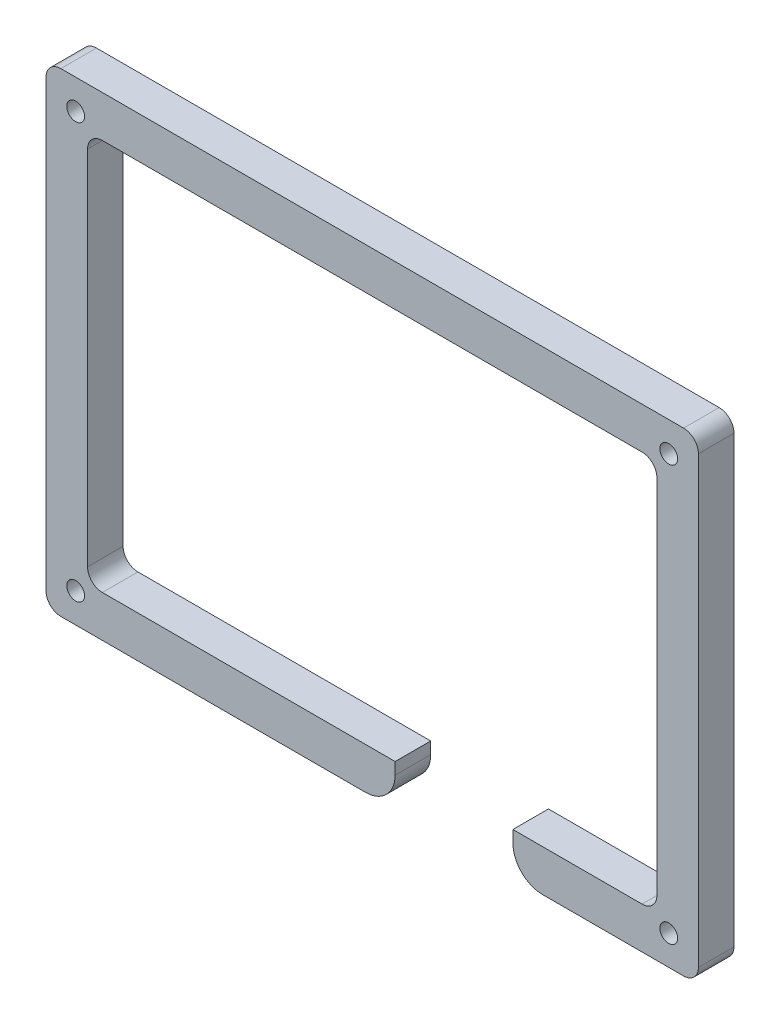
ISO-10303-21;
HEADER;
FILE_DESCRIPTION(('STEP AP214'),'2;1');
FILE_NAME('part.step','',(''),(''),'','','');
FILE_SCHEMA(('AUTOMOTIVE_DESIGN { 1 0 10303 214 1 1 1 1 }'));
ENDSEC;
DATA;
#1=APPLICATION_CONTEXT('core data for automotive mechanical design processes');
#2=APPLICATION_PROTOCOL_DEFINITION('international standard','automotive_design',2000,#1);
#3=PRODUCT_CONTEXT('',#1,'mechanical');
#4=PRODUCT('Part','Part','',(#3));
#5=PRODUCT_RELATED_PRODUCT_CATEGORY('part','',(#4));
#6=PRODUCT_DEFINITION_FORMATION('','',#4);
#7=PRODUCT_DEFINITION_CONTEXT('part definition',#1,'design');
#8=PRODUCT_DEFINITION('design','',#6,#7);
#9=PRODUCT_DEFINITION_SHAPE('','',#8);
#10=(LENGTH_UNIT() NAMED_UNIT(*) SI_UNIT(.MILLI.,.METRE.));
#11=(NAMED_UNIT(*) PLANE_ANGLE_UNIT() SI_UNIT($,.RADIAN.));
#12=(NAMED_UNIT(*) SI_UNIT($,.STERADIAN.) SOLID_ANGLE_UNIT());
#13=UNCERTAINTY_MEASURE_WITH_UNIT(LENGTH_MEASURE(1.E-05),#10,'distance_accuracy_value','');
#14=(GEOMETRIC_REPRESENTATION_CONTEXT(3) GLOBAL_UNCERTAINTY_ASSIGNED_CONTEXT((#13)) GLOBAL_UNIT_ASSIGNED_CONTEXT((#10,
#11,#12)) REPRESENTATION_CONTEXT('',''));
#15=CARTESIAN_POINT('',(0.,0.,0.));
#16=DIRECTION('',(0.,0.,1.));
#17=DIRECTION('',(1.,0.,0.));
#18=AXIS2_PLACEMENT_3D('',#15,#16,#17);
#19=CARTESIAN_POINT('',(0.335362480209929,0.,6.));
#20=DIRECTION('',(0.,1.,0.));
#21=DIRECTION('',(-1.,0.,0.));
#22=AXIS2_PLACEMENT_3D('',#19,#20,#21);
#23=PLANE('',#22);
#24=DIRECTION('',(1.,0.,0.));
#25=VECTOR('',#24,1.);
#26=CARTESIAN_POINT('',(0.335362480209929,0.,6.));
#27=LINE('',#26,#25);
#28=CARTESIAN_POINT('',(-25.9354451381227,0.,6.));
#29=VERTEX_POINT('',#28);
#30=CARTESIAN_POINT('',(-2.16463751979007,0.,6.));
#31=VERTEX_POINT('',#30);
#32=EDGE_CURVE('E294',#29,#31,#27,.T.);
#33=ORIENTED_EDGE('',*,*,#32,.F.);
#34=DIRECTION('',(0.,0.,1.));
#35=VECTOR('',#34,1.);
#36=CARTESIAN_POINT('',(-25.9354451381227,0.,6.));
#37=LINE('',#36,#35);
#38=CARTESIAN_POINT('',(-25.9354451381227,0.,0.));
#39=VERTEX_POINT('',#38);
#40=EDGE_CURVE('E11',#29,#39,#37,.F.);
#41=ORIENTED_EDGE('',*,*,#40,.T.);
#42=DIRECTION('',(1.,0.,0.));
#43=VECTOR('',#42,1.);
#44=CARTESIAN_POINT('',(0.335362480209929,0.,0.));
#45=LINE('',#44,#43);
#46=CARTESIAN_POINT('',(-2.16463751979007,0.,0.));
#47=VERTEX_POINT('',#46);
#48=EDGE_CURVE('E306',#39,#47,#45,.T.);
#49=ORIENTED_EDGE('',*,*,#48,.T.);
#50=DIRECTION('',(0.,0.,-1.));
#51=VECTOR('',#50,1.);
#52=CARTESIAN_POINT('',(-2.16463751979007,0.,6.));
#53=LINE('',#52,#51);
#54=EDGE_CURVE('E373',#47,#31,#53,.F.);
#55=ORIENTED_EDGE('',*,*,#54,.T.);
#56=EDGE_LOOP('',(#33,#41,#49,#55));
#57=FACE_BOUND('',#56,.T.);
#58=ADVANCED_FACE('F33',(#57),#23,.F.);
#59=CARTESIAN_POINT('',(-6.66463751979007,7.,6.));
#60=DIRECTION('',(0.,1.,0.));
#61=DIRECTION('',(-1.,0.,0.));
#62=AXIS2_PLACEMENT_3D('',#59,#60,#61);
#63=PLANE('',#62);
#64=DIRECTION('',(1.,0.,0.));
#65=VECTOR('',#64,1.);
#66=CARTESIAN_POINT('',(-6.66463751979007,7.,0.));
#67=LINE('',#66,#65);
#68=CARTESIAN_POINT('',(-30.9497540323872,6.99999999999999,0.));
#69=VERTEX_POINT('',#68);
#70=CARTESIAN_POINT('',(-9.16463751979007,7.,0.));
#71=VERTEX_POINT('',#70);
#72=EDGE_CURVE('E282',#69,#71,#67,.T.);
#73=ORIENTED_EDGE('',*,*,#72,.F.);
#74=DIRECTION('',(0.,0.,1.));
#75=VECTOR('',#74,1.);
#76=CARTESIAN_POINT('',(-30.9497540323872,6.99999999999999,-177.683724251175));
#77=LINE('',#76,#75);
#78=CARTESIAN_POINT('',(-30.9497540323872,7.,6.));
#79=VERTEX_POINT('',#78);
#80=EDGE_CURVE('E208',#69,#79,#77,.T.);
#81=ORIENTED_EDGE('',*,*,#80,.T.);
#82=DIRECTION('',(1.,0.,0.));
#83=VECTOR('',#82,1.);
#84=CARTESIAN_POINT('',(-6.66463751979007,7.,6.));
#85=LINE('',#84,#83);
#86=CARTESIAN_POINT('',(-9.16463751979007,7.,6.));
#87=VERTEX_POINT('',#86);
#88=EDGE_CURVE('E204',#79,#87,#85,.T.);
#89=ORIENTED_EDGE('',*,*,#88,.T.);
#90=DIRECTION('',(0.,0.,-1.));
#91=VECTOR('',#90,1.);
#92=CARTESIAN_POINT('',(-9.16463751979007,7.,0.));
#93=LINE('',#92,#91);
#94=EDGE_CURVE('E323',#87,#71,#93,.T.);
#95=ORIENTED_EDGE('',*,*,#94,.T.);
#96=EDGE_LOOP('',(#73,#81,#89,#95));
#97=FACE_BOUND('',#96,.T.);
#98=ADVANCED_FACE('F422',(#97),#63,.T.);
#99=CARTESIAN_POINT('',(0.,0.,6.));
#100=DIRECTION('',(0.,0.,-1.));
#101=DIRECTION('',(-1.,0.,0.));
#102=AXIS2_PLACEMENT_3D('',#99,#100,#101);
#103=PLANE('',#102);
#104=CARTESIAN_POINT('',(-104.66463751979,75.,6.));
#105=DIRECTION('',(0.,0.,1.));
#106=DIRECTION('',(1.,0.,0.));
#107=AXIS2_PLACEMENT_3D('',#104,#105,#106);
#108=CIRCLE('',#107,1.5);
#109=CARTESIAN_POINT('',(-103.16463751979,75.,6.));
#110=VERTEX_POINT('',#109);
#111=EDGE_CURVE('E236',#110,#110,#108,.T.);
#112=ORIENTED_EDGE('',*,*,#111,.F.);
#113=EDGE_LOOP('',(#112));
#114=FACE_BOUND('',#113,.T.);
#115=CARTESIAN_POINT('',(-104.66463751979,4.99999999999999,6.));
#116=DIRECTION('',(0.,0.,1.));
#117=DIRECTION('',(1.,0.,0.));
#118=AXIS2_PLACEMENT_3D('',#115,#116,#117);
#119=CIRCLE('',#118,1.5);
#120=CARTESIAN_POINT('',(-103.16463751979,4.99999999999999,6.));
#121=VERTEX_POINT('',#120);
#122=EDGE_CURVE('E244',#121,#121,#119,.T.);
#123=ORIENTED_EDGE('',*,*,#122,.F.);
#124=EDGE_LOOP('',(#123));
#125=FACE_BOUND('',#124,.T.);
#126=CARTESIAN_POINT('',(-4.66463751979007,4.99999999999999,6.));
#127=DIRECTION('',(0.,0.,1.));
#128=DIRECTION('',(1.,0.,0.));
#129=AXIS2_PLACEMENT_3D('',#126,#127,#128);
#130=CIRCLE('',#129,1.5);
#131=CARTESIAN_POINT('',(-3.16463751979007,4.99999999999999,6.));
#132=VERTEX_POINT('',#131);
#133=EDGE_CURVE('E249',#132,#132,#130,.T.);
#134=ORIENTED_EDGE('',*,*,#133,.F.);
#135=EDGE_LOOP('',(#134));
#136=FACE_BOUND('',#135,.T.);
#137=CARTESIAN_POINT('',(-4.66463751979007,75.,6.));
#138=DIRECTION('',(0.,0.,1.));
#139=DIRECTION('',(1.,0.,0.));
#140=AXIS2_PLACEMENT_3D('',#137,#138,#139);
#141=CIRCLE('',#140,1.5);
#142=CARTESIAN_POINT('',(-3.16463751979007,75.,6.));
#143=VERTEX_POINT('',#142);
#144=EDGE_CURVE('E255',#143,#143,#141,.T.);
#145=ORIENTED_EDGE('',*,*,#144,.F.);
#146=EDGE_LOOP('',(#145));
#147=FACE_BOUND('',#146,.T.);
#148=CARTESIAN_POINT('',(-107.16463751979,0.,6.));
#149=VERTEX_POINT('',#148);
#150=CARTESIAN_POINT('',(-55.7991016044276,0.,6.));
#151=VERTEX_POINT('',#150);
#152=EDGE_CURVE('E295',#149,#151,#27,.T.);
#153=ORIENTED_EDGE('',*,*,#152,.T.);
#154=CARTESIAN_POINT('',(-55.7991016044276,4.99999999999999,6.));
#155=DIRECTION('',(0.,0.,-1.));
#156=DIRECTION('',(-1.,0.,0.));
#157=AXIS2_PLACEMENT_3D('',#154,#155,#156);
#158=CIRCLE('',#157,5.);
#159=CARTESIAN_POINT('',(-50.7991016044276,4.99999999999999,6.));
#160=VERTEX_POINT('',#159);
#161=EDGE_CURVE('E188',#151,#160,#158,.F.);
#162=ORIENTED_EDGE('',*,*,#161,.T.);
#163=DIRECTION('',(0.,1.,0.));
#164=VECTOR('',#163,1.);
#165=CARTESIAN_POINT('',(-50.7991016044276,0.,6.));
#166=LINE('',#165,#164);
#167=CARTESIAN_POINT('',(-50.7991016044276,6.99999999999999,6.00000000000001));
#168=VERTEX_POINT('',#167);
#169=EDGE_CURVE('E182',#160,#168,#166,.T.);
#170=ORIENTED_EDGE('',*,*,#169,.T.);
#171=CARTESIAN_POINT('',(-100.16463751979,6.99999999999999,6.));
#172=VERTEX_POINT('',#171);
#173=EDGE_CURVE('E186',#172,#168,#85,.T.);
#174=ORIENTED_EDGE('',*,*,#173,.F.);
#175=CARTESIAN_POINT('',(-100.16463751979,9.49999999999999,6.));
#176=DIRECTION('',(0.,0.,-1.));
#177=DIRECTION('',(-1.,0.,0.));
#178=AXIS2_PLACEMENT_3D('',#175,#176,#177);
#179=CIRCLE('',#178,2.5);
#180=CARTESIAN_POINT('',(-102.66463751979,9.49999999999999,6.));
#181=VERTEX_POINT('',#180);
#182=EDGE_CURVE('E337',#172,#181,#179,.T.);
#183=ORIENTED_EDGE('',*,*,#182,.T.);
#184=DIRECTION('',(0.,-1.,0.));
#185=VECTOR('',#184,1.);
#186=CARTESIAN_POINT('',(-102.66463751979,73.,6.));
#187=LINE('',#186,#185);
#188=CARTESIAN_POINT('',(-102.66463751979,70.5,6.));
#189=VERTEX_POINT('',#188);
#190=EDGE_CURVE('E271',#189,#181,#187,.T.);
#191=ORIENTED_EDGE('',*,*,#190,.F.);
#192=CARTESIAN_POINT('',(-100.16463751979,70.5,6.));
#193=DIRECTION('',(0.,0.,-1.));
#194=DIRECTION('',(-1.,0.,0.));
#195=AXIS2_PLACEMENT_3D('',#192,#193,#194);
#196=CIRCLE('',#195,2.5);
#197=CARTESIAN_POINT('',(-100.16463751979,73.,6.));
#198=VERTEX_POINT('',#197);
#199=EDGE_CURVE('E333',#189,#198,#196,.T.);
#200=ORIENTED_EDGE('',*,*,#199,.T.);
#201=DIRECTION('',(-1.,0.,0.));
#202=VECTOR('',#201,1.);
#203=CARTESIAN_POINT('',(-6.66463751979008,73.,6.));
#204=LINE('',#203,#202);
#205=CARTESIAN_POINT('',(-9.16463751979008,73.,6.));
#206=VERTEX_POINT('',#205);
#207=EDGE_CURVE('E267',#206,#198,#204,.T.);
#208=ORIENTED_EDGE('',*,*,#207,.F.);
#209=CARTESIAN_POINT('',(-9.16463751979008,70.5,6.));
#210=DIRECTION('',(0.,0.,-1.));
#211=DIRECTION('',(-1.,0.,0.));
#212=AXIS2_PLACEMENT_3D('',#209,#210,#211);
#213=CIRCLE('',#212,2.5);
#214=CARTESIAN_POINT('',(-6.66463751979008,70.5,6.));
#215=VERTEX_POINT('',#214);
#216=EDGE_CURVE('E329',#206,#215,#213,.T.);
#217=ORIENTED_EDGE('',*,*,#216,.T.);
#218=DIRECTION('',(0.,1.,0.));
#219=VECTOR('',#218,1.);
#220=CARTESIAN_POINT('',(-6.66463751979008,73.,6.));
#221=LINE('',#220,#219);
#222=CARTESIAN_POINT('',(-6.66463751979007,9.49999999999999,6.));
#223=VERTEX_POINT('',#222);
#224=EDGE_CURVE('E264',#223,#215,#221,.T.);
#225=ORIENTED_EDGE('',*,*,#224,.F.);
#226=CARTESIAN_POINT('',(-9.16463751979007,9.5,6.));
#227=DIRECTION('',(0.,0.,-1.));
#228=DIRECTION('',(-1.,0.,0.));
#229=AXIS2_PLACEMENT_3D('',#226,#227,#228);
#230=CIRCLE('',#229,2.5);
#231=EDGE_CURVE('E341',#223,#87,#230,.T.);
#232=ORIENTED_EDGE('',*,*,#231,.T.);
#233=ORIENTED_EDGE('',*,*,#88,.F.);
#234=DIRECTION('',(0.00709140639232641,-0.999974855661571,0.));
#235=VECTOR('',#234,1.);
#236=CARTESIAN_POINT('',(-30.8985590331902,-0.219119748662757,6.));
#237=LINE('',#236,#235);
#238=CARTESIAN_POINT('',(-30.9353194164306,4.96454296803837,6.));
#239=VERTEX_POINT('',#238);
#240=EDGE_CURVE('E232',#79,#239,#237,.T.);
#241=ORIENTED_EDGE('',*,*,#240,.T.);
#242=CARTESIAN_POINT('',(-25.9354451381227,5.,6.00000000000001));
#243=DIRECTION('',(0.,0.,-1.));
#244=DIRECTION('',(-1.,0.,0.));
#245=AXIS2_PLACEMENT_3D('',#242,#243,#244);
#246=CIRCLE('',#245,5.);
#247=EDGE_CURVE('E220',#239,#29,#246,.F.);
#248=ORIENTED_EDGE('',*,*,#247,.T.);
#249=ORIENTED_EDGE('',*,*,#32,.T.);
#250=CARTESIAN_POINT('',(-2.16463751979007,2.5,6.));
#251=DIRECTION('',(0.,0.,-1.));
#252=DIRECTION('',(-1.,0.,0.));
#253=AXIS2_PLACEMENT_3D('',#250,#251,#252);
#254=CIRCLE('',#253,2.5);
#255=CARTESIAN_POINT('',(0.335362480209929,2.5,6.));
#256=VERTEX_POINT('',#255);
#257=EDGE_CURVE('E366',#31,#256,#254,.F.);
#258=ORIENTED_EDGE('',*,*,#257,.T.);
#259=DIRECTION('',(0.,1.,0.));
#260=VECTOR('',#259,1.);
#261=CARTESIAN_POINT('',(0.335362480209919,80.,6.));
#262=LINE('',#261,#260);
#263=CARTESIAN_POINT('',(0.33536248020992,77.5,6.));
#264=VERTEX_POINT('',#263);
#265=EDGE_CURVE('E284',#256,#264,#262,.T.);
#266=ORIENTED_EDGE('',*,*,#265,.T.);
#267=CARTESIAN_POINT('',(-2.16463751979008,77.5,6.));
#268=DIRECTION('',(0.,0.,-1.));
#269=DIRECTION('',(-1.,0.,0.));
#270=AXIS2_PLACEMENT_3D('',#267,#268,#269);
#271=CIRCLE('',#270,2.5);
#272=CARTESIAN_POINT('',(-2.16463751979008,80.,6.));
#273=VERTEX_POINT('',#272);
#274=EDGE_CURVE('E368',#264,#273,#271,.F.);
#275=ORIENTED_EDGE('',*,*,#274,.T.);
#276=DIRECTION('',(-1.,0.,0.));
#277=VECTOR('',#276,1.);
#278=CARTESIAN_POINT('',(0.335362480209919,80.,6.));
#279=LINE('',#278,#277);
#280=CARTESIAN_POINT('',(-107.16463751979,80.,6.));
#281=VERTEX_POINT('',#280);
#282=EDGE_CURVE('E287',#273,#281,#279,.T.);
#283=ORIENTED_EDGE('',*,*,#282,.T.);
#284=CARTESIAN_POINT('',(-107.16463751979,77.5,6.));
#285=DIRECTION('',(0.,0.,-1.));
#286=DIRECTION('',(-1.,0.,0.));
#287=AXIS2_PLACEMENT_3D('',#284,#285,#286);
#288=CIRCLE('',#287,2.5);
#289=CARTESIAN_POINT('',(-109.66463751979,77.5,6.));
#290=VERTEX_POINT('',#289);
#291=EDGE_CURVE('E362',#281,#290,#288,.F.);
#292=ORIENTED_EDGE('',*,*,#291,.T.);
#293=DIRECTION('',(0.,-1.,0.));
#294=VECTOR('',#293,1.);
#295=CARTESIAN_POINT('',(-109.66463751979,80.,6.));
#296=LINE('',#295,#294);
#297=CARTESIAN_POINT('',(-109.66463751979,2.49999999999999,6.));
#298=VERTEX_POINT('',#297);
#299=EDGE_CURVE('E291',#290,#298,#296,.T.);
#300=ORIENTED_EDGE('',*,*,#299,.T.);
#301=CARTESIAN_POINT('',(-107.16463751979,2.49999999999999,6.));
#302=DIRECTION('',(0.,0.,-1.));
#303=DIRECTION('',(-1.,0.,0.));
#304=AXIS2_PLACEMENT_3D('',#301,#302,#303);
#305=CIRCLE('',#304,2.5);
#306=EDGE_CURVE('E364',#298,#149,#305,.F.);
#307=ORIENTED_EDGE('',*,*,#306,.T.);
#308=EDGE_LOOP('',(#153,#162,#170,#174,#183,#191,#200,#208,#217,#225,#232,#233,#241,#248,#249,
#258,#266,#275,#283,#292,#300,#307));
#309=FACE_BOUND('',#308,.T.);
#310=ADVANCED_FACE('F185',(#114,#125,#136,#147,#309),#103,.F.);
#311=CARTESIAN_POINT('',(0.,0.,0.));
#312=DIRECTION('',(0.,0.,-1.));
#313=DIRECTION('',(-1.,0.,0.));
#314=AXIS2_PLACEMENT_3D('',#311,#312,#313);
#315=PLANE('',#314);
#316=DIRECTION('',(0.,1.,0.));
#317=VECTOR('',#316,1.);
#318=CARTESIAN_POINT('',(-50.7991016044276,0.,0.));
#319=LINE('',#318,#317);
#320=CARTESIAN_POINT('',(-50.7991016044276,4.99999999999999,0.));
#321=VERTEX_POINT('',#320);
#322=CARTESIAN_POINT('',(-50.7991016044276,7.,0.));
#323=VERTEX_POINT('',#322);
#324=EDGE_CURVE('E193',#321,#323,#319,.T.);
#325=ORIENTED_EDGE('',*,*,#324,.F.);
#326=CARTESIAN_POINT('',(-55.7991016044276,4.99999999999999,0.));
#327=DIRECTION('',(0.,0.,-1.));
#328=DIRECTION('',(-1.,0.,0.));
#329=AXIS2_PLACEMENT_3D('',#326,#327,#328);
#330=CIRCLE('',#329,5.);
#331=CARTESIAN_POINT('',(-55.7991016044276,0.,0.));
#332=VERTEX_POINT('',#331);
#333=EDGE_CURVE('E226',#321,#332,#330,.T.);
#334=ORIENTED_EDGE('',*,*,#333,.T.);
#335=CARTESIAN_POINT('',(-107.16463751979,0.,0.));
#336=VERTEX_POINT('',#335);
#337=EDGE_CURVE('E288',#336,#332,#45,.T.);
#338=ORIENTED_EDGE('',*,*,#337,.F.);
#339=CARTESIAN_POINT('',(-107.16463751979,2.49999999999999,0.));
#340=DIRECTION('',(0.,0.,-1.));
#341=DIRECTION('',(-1.,0.,0.));
#342=AXIS2_PLACEMENT_3D('',#339,#340,#341);
#343=CIRCLE('',#342,2.5);
#344=CARTESIAN_POINT('',(-109.66463751979,2.49999999999999,0.));
#345=VERTEX_POINT('',#344);
#346=EDGE_CURVE('E350',#336,#345,#343,.T.);
#347=ORIENTED_EDGE('',*,*,#346,.T.);
#348=DIRECTION('',(0.,-1.,0.));
#349=VECTOR('',#348,1.);
#350=CARTESIAN_POINT('',(-109.66463751979,80.,0.));
#351=LINE('',#350,#349);
#352=CARTESIAN_POINT('',(-109.66463751979,77.5,0.));
#353=VERTEX_POINT('',#352);
#354=EDGE_CURVE('E303',#353,#345,#351,.T.);
#355=ORIENTED_EDGE('',*,*,#354,.F.);
#356=CARTESIAN_POINT('',(-107.16463751979,77.5,0.));
#357=DIRECTION('',(0.,0.,-1.));
#358=DIRECTION('',(-1.,0.,0.));
#359=AXIS2_PLACEMENT_3D('',#356,#357,#358);
#360=CIRCLE('',#359,2.5);
#361=CARTESIAN_POINT('',(-107.16463751979,80.,0.));
#362=VERTEX_POINT('',#361);
#363=EDGE_CURVE('E348',#353,#362,#360,.T.);
#364=ORIENTED_EDGE('',*,*,#363,.T.);
#365=DIRECTION('',(-1.,0.,0.));
#366=VECTOR('',#365,1.);
#367=CARTESIAN_POINT('',(0.335362480209919,80.,0.));
#368=LINE('',#367,#366);
#369=CARTESIAN_POINT('',(-2.16463751979008,80.,0.));
#370=VERTEX_POINT('',#369);
#371=EDGE_CURVE('E300',#370,#362,#368,.T.);
#372=ORIENTED_EDGE('',*,*,#371,.F.);
#373=CARTESIAN_POINT('',(-2.16463751979008,77.5,0.));
#374=DIRECTION('',(0.,0.,-1.));
#375=DIRECTION('',(-1.,0.,0.));
#376=AXIS2_PLACEMENT_3D('',#373,#374,#375);
#377=CIRCLE('',#376,2.5);
#378=CARTESIAN_POINT('',(0.33536248020992,77.5,0.));
#379=VERTEX_POINT('',#378);
#380=EDGE_CURVE('E355',#370,#379,#377,.T.);
#381=ORIENTED_EDGE('',*,*,#380,.T.);
#382=DIRECTION('',(0.,1.,0.));
#383=VECTOR('',#382,1.);
#384=CARTESIAN_POINT('',(0.335362480209919,80.,0.));
#385=LINE('',#384,#383);
#386=CARTESIAN_POINT('',(0.335362480209929,2.5,0.));
#387=VERTEX_POINT('',#386);
#388=EDGE_CURVE('E203',#387,#379,#385,.T.);
#389=ORIENTED_EDGE('',*,*,#388,.F.);
#390=CARTESIAN_POINT('',(-2.16463751979007,2.5,0.));
#391=DIRECTION('',(0.,0.,-1.));
#392=DIRECTION('',(-1.,0.,0.));
#393=AXIS2_PLACEMENT_3D('',#390,#391,#392);
#394=CIRCLE('',#393,2.5);
#395=EDGE_CURVE('E352',#387,#47,#394,.T.);
#396=ORIENTED_EDGE('',*,*,#395,.T.);
#397=ORIENTED_EDGE('',*,*,#48,.F.);
#398=CARTESIAN_POINT('',(-25.9354451381227,5.,0.));
#399=DIRECTION('',(0.,0.,-1.));
#400=DIRECTION('',(-1.,0.,0.));
#401=AXIS2_PLACEMENT_3D('',#398,#399,#400);
#402=CIRCLE('',#401,5.);
#403=CARTESIAN_POINT('',(-30.9353194164306,4.96454296803837,0.));
#404=VERTEX_POINT('',#403);
#405=EDGE_CURVE('E53',#39,#404,#402,.T.);
#406=ORIENTED_EDGE('',*,*,#405,.T.);
#407=DIRECTION('',(0.00709140639232641,-0.999974855661571,0.));
#408=VECTOR('',#407,1.);
#409=CARTESIAN_POINT('',(-30.8985590331902,-0.219119748662757,0.));
#410=LINE('',#409,#408);
#411=EDGE_CURVE('E192',#69,#404,#410,.T.);
#412=ORIENTED_EDGE('',*,*,#411,.F.);
#413=ORIENTED_EDGE('',*,*,#72,.T.);
#414=CARTESIAN_POINT('',(-9.16463751979007,9.5,0.));
#415=DIRECTION('',(0.,0.,-1.));
#416=DIRECTION('',(-1.,0.,0.));
#417=AXIS2_PLACEMENT_3D('',#414,#415,#416);
#418=CIRCLE('',#417,2.5);
#419=CARTESIAN_POINT('',(-6.66463751979007,9.49999999999999,0.));
#420=VERTEX_POINT('',#419);
#421=EDGE_CURVE('E339',#71,#420,#418,.F.);
#422=ORIENTED_EDGE('',*,*,#421,.T.);
#423=DIRECTION('',(0.,1.,0.));
#424=VECTOR('',#423,1.);
#425=CARTESIAN_POINT('',(-6.66463751979008,73.,0.));
#426=LINE('',#425,#424);
#427=CARTESIAN_POINT('',(-6.66463751979008,70.5,0.));
#428=VERTEX_POINT('',#427);
#429=EDGE_CURVE('E261',#420,#428,#426,.T.);
#430=ORIENTED_EDGE('',*,*,#429,.T.);
#431=CARTESIAN_POINT('',(-9.16463751979008,70.5,0.));
#432=DIRECTION('',(0.,0.,-1.));
#433=DIRECTION('',(-1.,0.,0.));
#434=AXIS2_PLACEMENT_3D('',#431,#432,#433);
#435=CIRCLE('',#434,2.5);
#436=CARTESIAN_POINT('',(-9.16463751979008,73.,0.));
#437=VERTEX_POINT('',#436);
#438=EDGE_CURVE('E327',#428,#437,#435,.F.);
#439=ORIENTED_EDGE('',*,*,#438,.T.);
#440=DIRECTION('',(-1.,0.,0.));
#441=VECTOR('',#440,1.);
#442=CARTESIAN_POINT('',(-6.66463751979008,73.,0.));
#443=LINE('',#442,#441);
#444=CARTESIAN_POINT('',(-100.16463751979,73.,0.));
#445=VERTEX_POINT('',#444);
#446=EDGE_CURVE('E276',#437,#445,#443,.T.);
#447=ORIENTED_EDGE('',*,*,#446,.T.);
#448=CARTESIAN_POINT('',(-100.16463751979,70.5,0.));
#449=DIRECTION('',(0.,0.,-1.));
#450=DIRECTION('',(-1.,0.,0.));
#451=AXIS2_PLACEMENT_3D('',#448,#449,#450);
#452=CIRCLE('',#451,2.5);
#453=CARTESIAN_POINT('',(-102.66463751979,70.5,0.));
#454=VERTEX_POINT('',#453);
#455=EDGE_CURVE('E331',#445,#454,#452,.F.);
#456=ORIENTED_EDGE('',*,*,#455,.T.);
#457=DIRECTION('',(0.,-1.,0.));
#458=VECTOR('',#457,1.);
#459=CARTESIAN_POINT('',(-102.66463751979,73.,0.));
#460=LINE('',#459,#458);
#461=CARTESIAN_POINT('',(-102.66463751979,9.49999999999999,0.));
#462=VERTEX_POINT('',#461);
#463=EDGE_CURVE('E279',#454,#462,#460,.T.);
#464=ORIENTED_EDGE('',*,*,#463,.T.);
#465=CARTESIAN_POINT('',(-100.16463751979,9.49999999999999,0.));
#466=DIRECTION('',(0.,0.,-1.));
#467=DIRECTION('',(-1.,0.,0.));
#468=AXIS2_PLACEMENT_3D('',#465,#466,#467);
#469=CIRCLE('',#468,2.5);
#470=CARTESIAN_POINT('',(-100.16463751979,6.99999999999999,0.));
#471=VERTEX_POINT('',#470);
#472=EDGE_CURVE('E335',#462,#471,#469,.F.);
#473=ORIENTED_EDGE('',*,*,#472,.T.);
#474=EDGE_CURVE('E268',#471,#323,#67,.T.);
#475=ORIENTED_EDGE('',*,*,#474,.T.);
#476=EDGE_LOOP('',(#325,#334,#338,#347,#355,#364,#372,#381,#389,#396,#397,#406,#412,#413,#422,
#430,#439,#447,#456,#464,#473,#475));
#477=FACE_BOUND('',#476,.T.);
#478=CARTESIAN_POINT('',(-104.66463751979,75.,0.));
#479=DIRECTION('',(0.,0.,1.));
#480=DIRECTION('',(1.,0.,0.));
#481=AXIS2_PLACEMENT_3D('',#478,#479,#480);
#482=CIRCLE('',#481,1.5);
#483=CARTESIAN_POINT('',(-103.16463751979,75.,0.));
#484=VERTEX_POINT('',#483);
#485=EDGE_CURVE('E239',#484,#484,#482,.T.);
#486=ORIENTED_EDGE('',*,*,#485,.T.);
#487=EDGE_LOOP('',(#486));
#488=FACE_BOUND('',#487,.T.);
#489=CARTESIAN_POINT('',(-104.66463751979,4.99999999999999,0.));
#490=DIRECTION('',(0.,0.,1.));
#491=DIRECTION('',(1.,0.,0.));
#492=AXIS2_PLACEMENT_3D('',#489,#490,#491);
#493=CIRCLE('',#492,1.5);
#494=CARTESIAN_POINT('',(-103.16463751979,4.99999999999999,0.));
#495=VERTEX_POINT('',#494);
#496=EDGE_CURVE('E246',#495,#495,#493,.T.);
#497=ORIENTED_EDGE('',*,*,#496,.T.);
#498=EDGE_LOOP('',(#497));
#499=FACE_BOUND('',#498,.T.);
#500=CARTESIAN_POINT('',(-4.66463751979007,4.99999999999999,0.));
#501=DIRECTION('',(0.,0.,1.));
#502=DIRECTION('',(1.,0.,0.));
#503=AXIS2_PLACEMENT_3D('',#500,#501,#502);
#504=CIRCLE('',#503,1.5);
#505=CARTESIAN_POINT('',(-3.16463751979007,4.99999999999999,0.));
#506=VERTEX_POINT('',#505);
#507=EDGE_CURVE('E252',#506,#506,#504,.T.);
#508=ORIENTED_EDGE('',*,*,#507,.T.);
#509=EDGE_LOOP('',(#508));
#510=FACE_BOUND('',#509,.T.);
#511=CARTESIAN_POINT('',(-4.66463751979007,75.,0.));
#512=DIRECTION('',(0.,0.,1.));
#513=DIRECTION('',(1.,0.,0.));
#514=AXIS2_PLACEMENT_3D('',#511,#512,#513);
#515=CIRCLE('',#514,1.5);
#516=CARTESIAN_POINT('',(-3.16463751979007,75.,0.));
#517=VERTEX_POINT('',#516);
#518=EDGE_CURVE('E258',#517,#517,#515,.T.);
#519=ORIENTED_EDGE('',*,*,#518,.T.);
#520=EDGE_LOOP('',(#519));
#521=FACE_BOUND('',#520,.T.);
#522=ADVANCED_FACE('F384',(#477,#488,#499,#510,#521),#315,.T.);
#523=CARTESIAN_POINT('',(0.335362480209919,80.,6.));
#524=DIRECTION('',(-1.,0.,0.));
#525=DIRECTION('',(0.,-1.,0.));
#526=AXIS2_PLACEMENT_3D('',#523,#524,#525);
#527=PLANE('',#526);
#528=ORIENTED_EDGE('',*,*,#388,.T.);
#529=DIRECTION('',(0.,0.,-1.));
#530=VECTOR('',#529,1.);
#531=CARTESIAN_POINT('',(0.33536248020992,77.5,6.));
#532=LINE('',#531,#530);
#533=EDGE_CURVE('E360',#379,#264,#532,.F.);
#534=ORIENTED_EDGE('',*,*,#533,.T.);
#535=ORIENTED_EDGE('',*,*,#265,.F.);
#536=DIRECTION('',(0.,0.,-1.));
#537=VECTOR('',#536,1.);
#538=CARTESIAN_POINT('',(0.335362480209929,2.5,6.));
#539=LINE('',#538,#537);
#540=EDGE_CURVE('E357',#256,#387,#539,.T.);
#541=ORIENTED_EDGE('',*,*,#540,.T.);
#542=EDGE_LOOP('',(#528,#534,#535,#541));
#543=FACE_BOUND('',#542,.T.);
#544=ADVANCED_FACE('F406',(#543),#527,.F.);
#545=CARTESIAN_POINT('',(0.335362480209919,80.,6.));
#546=DIRECTION('',(0.,-1.,0.));
#547=DIRECTION('',(1.,0.,0.));
#548=AXIS2_PLACEMENT_3D('',#545,#546,#547);
#549=PLANE('',#548);
#550=ORIENTED_EDGE('',*,*,#282,.F.);
#551=DIRECTION('',(0.,0.,-1.));
#552=VECTOR('',#551,1.);
#553=CARTESIAN_POINT('',(-2.16463751979008,80.,6.));
#554=LINE('',#553,#552);
#555=EDGE_CURVE('E345',#273,#370,#554,.T.);
#556=ORIENTED_EDGE('',*,*,#555,.T.);
#557=ORIENTED_EDGE('',*,*,#371,.T.);
#558=DIRECTION('',(0.,0.,-1.));
#559=VECTOR('',#558,1.);
#560=CARTESIAN_POINT('',(-107.16463751979,80.,6.));
#561=LINE('',#560,#559);
#562=EDGE_CURVE('E343',#362,#281,#561,.F.);
#563=ORIENTED_EDGE('',*,*,#562,.T.);
#564=EDGE_LOOP('',(#550,#556,#557,#563));
#565=FACE_BOUND('',#564,.T.);
#566=ADVANCED_FACE('F400',(#565),#549,.F.);
#567=CARTESIAN_POINT('',(-109.66463751979,80.,6.));
#568=DIRECTION('',(1.,0.,0.));
#569=DIRECTION('',(0.,1.,0.));
#570=AXIS2_PLACEMENT_3D('',#567,#568,#569);
#571=PLANE('',#570);
#572=ORIENTED_EDGE('',*,*,#354,.T.);
#573=DIRECTION('',(0.,0.,-1.));
#574=VECTOR('',#573,1.);
#575=CARTESIAN_POINT('',(-109.66463751979,2.49999999999999,6.));
#576=LINE('',#575,#574);
#577=EDGE_CURVE('E209',#345,#298,#576,.F.);
#578=ORIENTED_EDGE('',*,*,#577,.T.);
#579=ORIENTED_EDGE('',*,*,#299,.F.);
#580=DIRECTION('',(0.,0.,-1.));
#581=VECTOR('',#580,1.);
#582=CARTESIAN_POINT('',(-109.66463751979,77.5,6.));
#583=LINE('',#582,#581);
#584=EDGE_CURVE('E214',#290,#353,#583,.T.);
#585=ORIENTED_EDGE('',*,*,#584,.T.);
#586=EDGE_LOOP('',(#572,#578,#579,#585));
#587=FACE_BOUND('',#586,.T.);
#588=ADVANCED_FACE('F380',(#587),#571,.F.);
#589=ORIENTED_EDGE('',*,*,#337,.T.);
#590=DIRECTION('',(0.,0.,1.));
#591=VECTOR('',#590,1.);
#592=CARTESIAN_POINT('',(-55.7991016044276,0.,6.));
#593=LINE('',#592,#591);
#594=EDGE_CURVE('E212',#332,#151,#593,.T.);
#595=ORIENTED_EDGE('',*,*,#594,.T.);
#596=ORIENTED_EDGE('',*,*,#152,.F.);
#597=DIRECTION('',(0.,0.,-1.));
#598=VECTOR('',#597,1.);
#599=CARTESIAN_POINT('',(-107.16463751979,0.,6.));
#600=LINE('',#599,#598);
#601=EDGE_CURVE('E370',#149,#336,#600,.T.);
#602=ORIENTED_EDGE('',*,*,#601,.T.);
#603=EDGE_LOOP('',(#589,#595,#596,#602));
#604=FACE_BOUND('',#603,.T.);
#605=ADVANCED_FACE('F394',(#604),#23,.F.);
#606=CARTESIAN_POINT('',(-6.66463751979008,73.,6.));
#607=DIRECTION('',(-1.,0.,0.));
#608=DIRECTION('',(0.,-1.,0.));
#609=AXIS2_PLACEMENT_3D('',#606,#607,#608);
#610=PLANE('',#609);
#611=ORIENTED_EDGE('',*,*,#224,.T.);
#612=DIRECTION('',(0.,0.,-1.));
#613=VECTOR('',#612,1.);
#614=CARTESIAN_POINT('',(-6.66463751979008,70.5,0.));
#615=LINE('',#614,#613);
#616=EDGE_CURVE('E310',#215,#428,#615,.T.);
#617=ORIENTED_EDGE('',*,*,#616,.T.);
#618=ORIENTED_EDGE('',*,*,#429,.F.);
#619=DIRECTION('',(0.,0.,-1.));
#620=VECTOR('',#619,1.);
#621=CARTESIAN_POINT('',(-6.66463751979007,9.5,6.));
#622=LINE('',#621,#620);
#623=EDGE_CURVE('E297',#420,#223,#622,.F.);
#624=ORIENTED_EDGE('',*,*,#623,.T.);
#625=EDGE_LOOP('',(#611,#617,#618,#624));
#626=FACE_BOUND('',#625,.T.);
#627=ADVANCED_FACE('F432',(#626),#610,.T.);
#628=CARTESIAN_POINT('',(-6.66463751979008,73.,6.));
#629=DIRECTION('',(0.,-1.,0.));
#630=DIRECTION('',(1.,0.,0.));
#631=AXIS2_PLACEMENT_3D('',#628,#629,#630);
#632=PLANE('',#631);
#633=ORIENTED_EDGE('',*,*,#446,.F.);
#634=DIRECTION('',(0.,0.,-1.));
#635=VECTOR('',#634,1.);
#636=CARTESIAN_POINT('',(-9.16463751979008,73.,6.));
#637=LINE('',#636,#635);
#638=EDGE_CURVE('E316',#437,#206,#637,.F.);
#639=ORIENTED_EDGE('',*,*,#638,.T.);
#640=ORIENTED_EDGE('',*,*,#207,.T.);
#641=DIRECTION('',(0.,0.,-1.));
#642=VECTOR('',#641,1.);
#643=CARTESIAN_POINT('',(-100.16463751979,73.,0.));
#644=LINE('',#643,#642);
#645=EDGE_CURVE('E313',#198,#445,#644,.T.);
#646=ORIENTED_EDGE('',*,*,#645,.T.);
#647=EDGE_LOOP('',(#633,#639,#640,#646));
#648=FACE_BOUND('',#647,.T.);
#649=ADVANCED_FACE('F437',(#648),#632,.T.);
#650=CARTESIAN_POINT('',(-102.66463751979,73.,6.));
#651=DIRECTION('',(1.,0.,0.));
#652=DIRECTION('',(0.,1.,0.));
#653=AXIS2_PLACEMENT_3D('',#650,#651,#652);
#654=PLANE('',#653);
#655=ORIENTED_EDGE('',*,*,#463,.F.);
#656=DIRECTION('',(0.,0.,-1.));
#657=VECTOR('',#656,1.);
#658=CARTESIAN_POINT('',(-102.66463751979,70.5,6.));
#659=LINE('',#658,#657);
#660=EDGE_CURVE('E321',#454,#189,#659,.F.);
#661=ORIENTED_EDGE('',*,*,#660,.T.);
#662=ORIENTED_EDGE('',*,*,#190,.T.);
#663=DIRECTION('',(0.,0.,-1.));
#664=VECTOR('',#663,1.);
#665=CARTESIAN_POINT('',(-102.66463751979,9.49999999999999,0.));
#666=LINE('',#665,#664);
#667=EDGE_CURVE('E318',#181,#462,#666,.T.);
#668=ORIENTED_EDGE('',*,*,#667,.T.);
#669=EDGE_LOOP('',(#655,#661,#662,#668));
#670=FACE_BOUND('',#669,.T.);
#671=ADVANCED_FACE('F496',(#670),#654,.T.);
#672=DIRECTION('',(0.,0.,1.));
#673=VECTOR('',#672,1.);
#674=CARTESIAN_POINT('',(-50.7991016044276,7.,6.));
#675=LINE('',#674,#673);
#676=EDGE_CURVE('E199',#323,#168,#675,.T.);
#677=ORIENTED_EDGE('',*,*,#676,.F.);
#678=ORIENTED_EDGE('',*,*,#474,.F.);
#679=DIRECTION('',(0.,0.,-1.));
#680=VECTOR('',#679,1.);
#681=CARTESIAN_POINT('',(-100.16463751979,6.99999999999999,6.));
#682=LINE('',#681,#680);
#683=EDGE_CURVE('E202',#471,#172,#682,.F.);
#684=ORIENTED_EDGE('',*,*,#683,.T.);
#685=ORIENTED_EDGE('',*,*,#173,.T.);
#686=EDGE_LOOP('',(#677,#678,#684,#685));
#687=FACE_BOUND('',#686,.T.);
#688=ADVANCED_FACE('F197',(#687),#63,.T.);
#689=CARTESIAN_POINT('',(-9.16463751979008,70.5,6.));
#690=DIRECTION('',(0.,0.,1.));
#691=DIRECTION('',(1.,0.,0.));
#692=AXIS2_PLACEMENT_3D('',#689,#690,#691);
#693=CYLINDRICAL_SURFACE('',#692,2.5);
#694=ORIENTED_EDGE('',*,*,#216,.F.);
#695=ORIENTED_EDGE('',*,*,#638,.F.);
#696=ORIENTED_EDGE('',*,*,#438,.F.);
#697=ORIENTED_EDGE('',*,*,#616,.F.);
#698=EDGE_LOOP('',(#694,#695,#696,#697));
#699=FACE_BOUND('',#698,.T.);
#700=ADVANCED_FACE('F447',(#699),#693,.F.);
#701=CARTESIAN_POINT('',(-100.16463751979,70.5,6.));
#702=DIRECTION('',(0.,0.,1.));
#703=DIRECTION('',(1.,0.,0.));
#704=AXIS2_PLACEMENT_3D('',#701,#702,#703);
#705=CYLINDRICAL_SURFACE('',#704,2.5);
#706=ORIENTED_EDGE('',*,*,#199,.F.);
#707=ORIENTED_EDGE('',*,*,#660,.F.);
#708=ORIENTED_EDGE('',*,*,#455,.F.);
#709=ORIENTED_EDGE('',*,*,#645,.F.);
#710=EDGE_LOOP('',(#706,#707,#708,#709));
#711=FACE_BOUND('',#710,.T.);
#712=ADVANCED_FACE('F450',(#711),#705,.F.);
#713=CARTESIAN_POINT('',(-100.16463751979,9.49999999999999,6.));
#714=DIRECTION('',(0.,0.,1.));
#715=DIRECTION('',(1.,0.,0.));
#716=AXIS2_PLACEMENT_3D('',#713,#714,#715);
#717=CYLINDRICAL_SURFACE('',#716,2.5);
#718=ORIENTED_EDGE('',*,*,#182,.F.);
#719=ORIENTED_EDGE('',*,*,#683,.F.);
#720=ORIENTED_EDGE('',*,*,#472,.F.);
#721=ORIENTED_EDGE('',*,*,#667,.F.);
#722=EDGE_LOOP('',(#718,#719,#720,#721));
#723=FACE_BOUND('',#722,.T.);
#724=ADVANCED_FACE('F454',(#723),#717,.F.);
#725=CARTESIAN_POINT('',(-9.16463751979007,9.5,6.));
#726=DIRECTION('',(0.,0.,1.));
#727=DIRECTION('',(1.,0.,0.));
#728=AXIS2_PLACEMENT_3D('',#725,#726,#727);
#729=CYLINDRICAL_SURFACE('',#728,2.5);
#730=ORIENTED_EDGE('',*,*,#231,.F.);
#731=ORIENTED_EDGE('',*,*,#623,.F.);
#732=ORIENTED_EDGE('',*,*,#421,.F.);
#733=ORIENTED_EDGE('',*,*,#94,.F.);
#734=EDGE_LOOP('',(#730,#731,#732,#733));
#735=FACE_BOUND('',#734,.T.);
#736=ADVANCED_FACE('F458',(#735),#729,.F.);
#737=CARTESIAN_POINT('',(-4.66463751979007,75.,0.));
#738=DIRECTION('',(0.,0.,1.));
#739=DIRECTION('',(1.,0.,0.));
#740=AXIS2_PLACEMENT_3D('',#737,#738,#739);
#741=CYLINDRICAL_SURFACE('',#740,1.5);
#742=ORIENTED_EDGE('',*,*,#518,.F.);
#743=EDGE_LOOP('',(#742));
#744=FACE_BOUND('',#743,.T.);
#745=ORIENTED_EDGE('',*,*,#144,.T.);
#746=EDGE_LOOP('',(#745));
#747=FACE_BOUND('',#746,.T.);
#748=ADVANCED_FACE('F462',(#744,#747),#741,.F.);
#749=CARTESIAN_POINT('',(-4.66463751979007,4.99999999999999,0.));
#750=DIRECTION('',(0.,0.,1.));
#751=DIRECTION('',(1.,0.,0.));
#752=AXIS2_PLACEMENT_3D('',#749,#750,#751);
#753=CYLINDRICAL_SURFACE('',#752,1.5);
#754=ORIENTED_EDGE('',*,*,#507,.F.);
#755=EDGE_LOOP('',(#754));
#756=FACE_BOUND('',#755,.T.);
#757=ORIENTED_EDGE('',*,*,#133,.T.);
#758=EDGE_LOOP('',(#757));
#759=FACE_BOUND('',#758,.T.);
#760=ADVANCED_FACE('F487',(#756,#759),#753,.F.);
#761=CARTESIAN_POINT('',(-104.66463751979,4.99999999999999,0.));
#762=DIRECTION('',(0.,0.,1.));
#763=DIRECTION('',(1.,0.,0.));
#764=AXIS2_PLACEMENT_3D('',#761,#762,#763);
#765=CYLINDRICAL_SURFACE('',#764,1.5);
#766=ORIENTED_EDGE('',*,*,#496,.F.);
#767=EDGE_LOOP('',(#766));
#768=FACE_BOUND('',#767,.T.);
#769=ORIENTED_EDGE('',*,*,#122,.T.);
#770=EDGE_LOOP('',(#769));
#771=FACE_BOUND('',#770,.T.);
#772=ADVANCED_FACE('F483',(#768,#771),#765,.F.);
#773=CARTESIAN_POINT('',(-104.66463751979,75.,0.));
#774=DIRECTION('',(0.,0.,1.));
#775=DIRECTION('',(1.,0.,0.));
#776=AXIS2_PLACEMENT_3D('',#773,#774,#775);
#777=CYLINDRICAL_SURFACE('',#776,1.5);
#778=ORIENTED_EDGE('',*,*,#485,.F.);
#779=EDGE_LOOP('',(#778));
#780=FACE_BOUND('',#779,.T.);
#781=ORIENTED_EDGE('',*,*,#111,.T.);
#782=EDGE_LOOP('',(#781));
#783=FACE_BOUND('',#782,.T.);
#784=ADVANCED_FACE('F466',(#780,#783),#777,.F.);
#785=CARTESIAN_POINT('',(-2.16463751979008,77.5,6.));
#786=DIRECTION('',(0.,0.,-1.));
#787=DIRECTION('',(-1.,0.,0.));
#788=AXIS2_PLACEMENT_3D('',#785,#786,#787);
#789=CYLINDRICAL_SURFACE('',#788,2.5);
#790=ORIENTED_EDGE('',*,*,#274,.F.);
#791=ORIENTED_EDGE('',*,*,#533,.F.);
#792=ORIENTED_EDGE('',*,*,#380,.F.);
#793=ORIENTED_EDGE('',*,*,#555,.F.);
#794=EDGE_LOOP('',(#790,#791,#792,#793));
#795=FACE_BOUND('',#794,.T.);
#796=ADVANCED_FACE('F410',(#795),#789,.T.);
#797=CARTESIAN_POINT('',(-2.16463751979007,2.5,6.));
#798=DIRECTION('',(0.,0.,-1.));
#799=DIRECTION('',(-1.,0.,0.));
#800=AXIS2_PLACEMENT_3D('',#797,#798,#799);
#801=CYLINDRICAL_SURFACE('',#800,2.5);
#802=ORIENTED_EDGE('',*,*,#257,.F.);
#803=ORIENTED_EDGE('',*,*,#54,.F.);
#804=ORIENTED_EDGE('',*,*,#395,.F.);
#805=ORIENTED_EDGE('',*,*,#540,.F.);
#806=EDGE_LOOP('',(#802,#803,#804,#805));
#807=FACE_BOUND('',#806,.T.);
#808=ADVANCED_FACE('F413',(#807),#801,.T.);
#809=CARTESIAN_POINT('',(-107.16463751979,2.49999999999999,6.));
#810=DIRECTION('',(0.,0.,-1.));
#811=DIRECTION('',(-1.,0.,0.));
#812=AXIS2_PLACEMENT_3D('',#809,#810,#811);
#813=CYLINDRICAL_SURFACE('',#812,2.5);
#814=ORIENTED_EDGE('',*,*,#306,.F.);
#815=ORIENTED_EDGE('',*,*,#577,.F.);
#816=ORIENTED_EDGE('',*,*,#346,.F.);
#817=ORIENTED_EDGE('',*,*,#601,.F.);
#818=EDGE_LOOP('',(#814,#815,#816,#817));
#819=FACE_BOUND('',#818,.T.);
#820=ADVANCED_FACE('F391',(#819),#813,.T.);
#821=CARTESIAN_POINT('',(-107.16463751979,77.5,6.));
#822=DIRECTION('',(0.,0.,-1.));
#823=DIRECTION('',(-1.,0.,0.));
#824=AXIS2_PLACEMENT_3D('',#821,#822,#823);
#825=CYLINDRICAL_SURFACE('',#824,2.5);
#826=ORIENTED_EDGE('',*,*,#291,.F.);
#827=ORIENTED_EDGE('',*,*,#562,.F.);
#828=ORIENTED_EDGE('',*,*,#363,.F.);
#829=ORIENTED_EDGE('',*,*,#584,.F.);
#830=EDGE_LOOP('',(#826,#827,#828,#829));
#831=FACE_BOUND('',#830,.T.);
#832=ADVANCED_FACE('F398',(#831),#825,.T.);
#833=CARTESIAN_POINT('',(-50.7991016044276,6.99999999999999,-177.683724251175));
#834=DIRECTION('',(-1.,0.,0.));
#835=DIRECTION('',(0.,0.,1.));
#836=AXIS2_PLACEMENT_3D('',#833,#834,#835);
#837=PLANE('',#836);
#838=ORIENTED_EDGE('',*,*,#169,.F.);
#839=DIRECTION('',(0.,0.,1.));
#840=VECTOR('',#839,1.);
#841=CARTESIAN_POINT('',(-50.7991016044276,4.99999999999999,-177.683724251175));
#842=LINE('',#841,#840);
#843=EDGE_CURVE('E223',#160,#321,#842,.F.);
#844=ORIENTED_EDGE('',*,*,#843,.T.);
#845=ORIENTED_EDGE('',*,*,#324,.T.);
#846=ORIENTED_EDGE('',*,*,#676,.T.);
#847=EDGE_LOOP('',(#838,#844,#845,#846));
#848=FACE_BOUND('',#847,.T.);
#849=ADVANCED_FACE('F206',(#848),#837,.F.);
#850=CARTESIAN_POINT('',(-30.9001129394485,0.,-177.683724251175));
#851=DIRECTION('',(0.999974855661571,0.0070914063923264,0.));
#852=DIRECTION('',(-0.00709140639232641,0.999974855661571,0.));
#853=AXIS2_PLACEMENT_3D('',#850,#851,#852);
#854=PLANE('',#853);
#855=ORIENTED_EDGE('',*,*,#411,.T.);
#856=DIRECTION('',(0.,0.,1.));
#857=VECTOR('',#856,1.);
#858=CARTESIAN_POINT('',(-30.9353194164306,4.96454296803837,-177.683724251175));
#859=LINE('',#858,#857);
#860=EDGE_CURVE('E41',#404,#239,#859,.T.);
#861=ORIENTED_EDGE('',*,*,#860,.T.);
#862=ORIENTED_EDGE('',*,*,#240,.F.);
#863=ORIENTED_EDGE('',*,*,#80,.F.);
#864=EDGE_LOOP('',(#855,#861,#862,#863));
#865=FACE_BOUND('',#864,.T.);
#866=ADVANCED_FACE('F231',(#865),#854,.F.);
#867=CARTESIAN_POINT('',(-55.7991016044276,4.99999999999999,6.));
#868=DIRECTION('',(0.,0.,1.));
#869=DIRECTION('',(1.,0.,0.));
#870=AXIS2_PLACEMENT_3D('',#867,#868,#869);
#871=CYLINDRICAL_SURFACE('',#870,5.);
#872=ORIENTED_EDGE('',*,*,#333,.F.);
#873=ORIENTED_EDGE('',*,*,#843,.F.);
#874=ORIENTED_EDGE('',*,*,#161,.F.);
#875=ORIENTED_EDGE('',*,*,#594,.F.);
#876=EDGE_LOOP('',(#872,#873,#874,#875));
#877=FACE_BOUND('',#876,.T.);
#878=ADVANCED_FACE('F416',(#877),#871,.T.);
#879=CARTESIAN_POINT('',(-25.9354451381227,5.,-177.683724251175));
#880=DIRECTION('',(0.,0.,1.));
#881=DIRECTION('',(1.,0.,0.));
#882=AXIS2_PLACEMENT_3D('',#879,#880,#881);
#883=CYLINDRICAL_SURFACE('',#882,5.);
#884=ORIENTED_EDGE('',*,*,#405,.F.);
#885=ORIENTED_EDGE('',*,*,#40,.F.);
#886=ORIENTED_EDGE('',*,*,#247,.F.);
#887=ORIENTED_EDGE('',*,*,#860,.F.);
#888=EDGE_LOOP('',(#884,#885,#886,#887));
#889=FACE_BOUND('',#888,.T.);
#890=ADVANCED_FACE('F35',(#889),#883,.T.);
#891=CLOSED_SHELL('',(#58,#98,#310,#522,#544,#566,#588,#605,#627,#649,#671,#688,#700,#712,#724,
#736,#748,#760,#772,#784,#796,#808,#820,#832,#849,#866,#878,#890));
#892=MANIFOLD_SOLID_BREP('B2',#891);
#893=ADVANCED_BREP_SHAPE_REPRESENTATION('',(#18,#892),#14);
#894=SHAPE_DEFINITION_REPRESENTATION(#9,#893);
ENDSEC;
END-ISO-10303-21;
